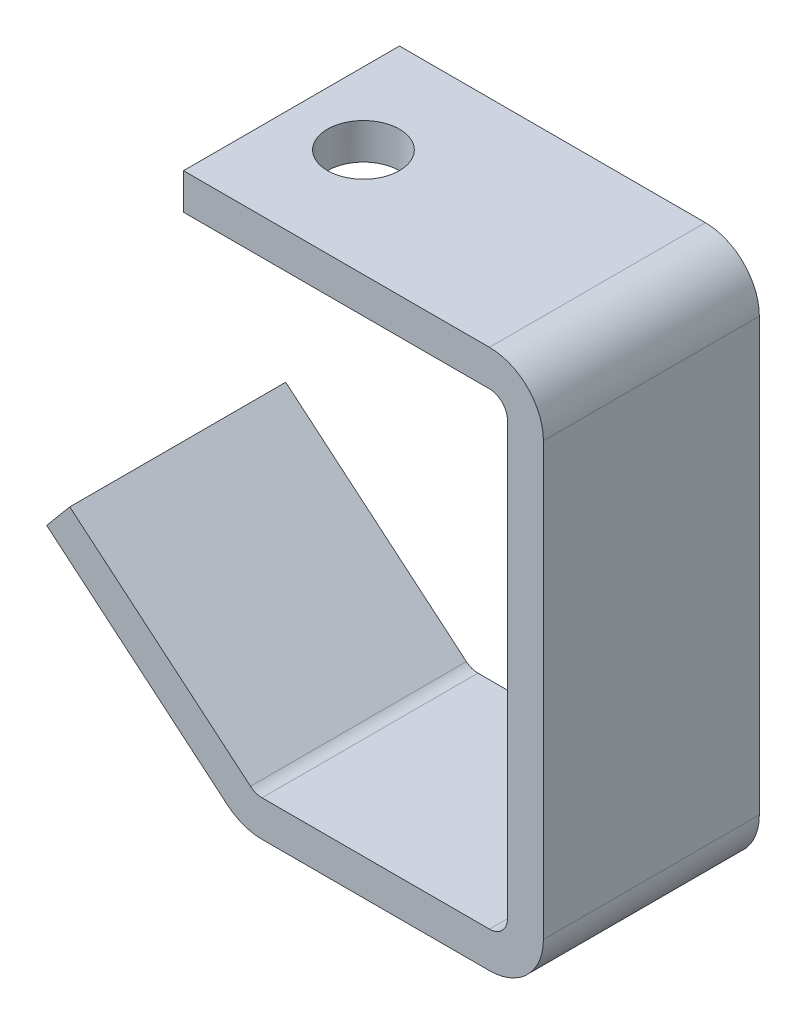
ISO-10303-21;
HEADER;
FILE_DESCRIPTION(('STEP AP214'),'2;1');
FILE_NAME('part.step','',(''),(''),'','','');
FILE_SCHEMA(('AUTOMOTIVE_DESIGN { 1 0 10303 214 1 1 1 1 }'));
ENDSEC;
DATA;
#1=APPLICATION_CONTEXT('core data for automotive mechanical design processes');
#2=APPLICATION_PROTOCOL_DEFINITION('international standard','automotive_design',2000,#1);
#3=PRODUCT_CONTEXT('',#1,'mechanical');
#4=PRODUCT('Part','Part','',(#3));
#5=PRODUCT_RELATED_PRODUCT_CATEGORY('part','',(#4));
#6=PRODUCT_DEFINITION_FORMATION('','',#4);
#7=PRODUCT_DEFINITION_CONTEXT('part definition',#1,'design');
#8=PRODUCT_DEFINITION('design','',#6,#7);
#9=PRODUCT_DEFINITION_SHAPE('','',#8);
#10=(LENGTH_UNIT() NAMED_UNIT(*) SI_UNIT(.MILLI.,.METRE.));
#11=(NAMED_UNIT(*) PLANE_ANGLE_UNIT() SI_UNIT($,.RADIAN.));
#12=(NAMED_UNIT(*) SI_UNIT($,.STERADIAN.) SOLID_ANGLE_UNIT());
#13=UNCERTAINTY_MEASURE_WITH_UNIT(LENGTH_MEASURE(1.E-05),#10,'distance_accuracy_value','');
#14=(GEOMETRIC_REPRESENTATION_CONTEXT(3) GLOBAL_UNCERTAINTY_ASSIGNED_CONTEXT((#13)) GLOBAL_UNIT_ASSIGNED_CONTEXT((#10,
#11,#12)) REPRESENTATION_CONTEXT('',''));
#15=CARTESIAN_POINT('',(0.,0.,0.));
#16=DIRECTION('',(0.,0.,1.));
#17=DIRECTION('',(1.,0.,0.));
#18=AXIS2_PLACEMENT_3D('',#15,#16,#17);
#19=CARTESIAN_POINT('',(-3.175,88.9,19.05));
#20=DIRECTION('',(0.,-1.,0.));
#21=DIRECTION('',(0.,0.,-1.));
#22=AXIS2_PLACEMENT_3D('',#19,#20,#21);
#23=PLANE('',#22);
#24=CARTESIAN_POINT('',(-44.45,88.9,0.));
#25=DIRECTION('',(0.,1.,0.));
#26=DIRECTION('',(0.,0.,1.));
#27=AXIS2_PLACEMENT_3D('',#24,#25,#26);
#28=CIRCLE('',#27,6.35);
#29=CARTESIAN_POINT('',(-44.45,88.9,6.35));
#30=VERTEX_POINT('',#29);
#31=EDGE_CURVE('E327',#30,#30,#28,.T.);
#32=ORIENTED_EDGE('',*,*,#31,.F.);
#33=EDGE_LOOP('',(#32));
#34=FACE_BOUND('',#33,.T.);
#35=DIRECTION('',(1.,0.,0.));
#36=VECTOR('',#35,1.);
#37=CARTESIAN_POINT('',(-3.175,88.9,-19.05));
#38=LINE('',#37,#36);
#39=CARTESIAN_POINT('',(-3.175,88.9,-19.05));
#40=VERTEX_POINT('',#39);
#41=CARTESIAN_POINT('',(-57.15,88.9,-19.05));
#42=VERTEX_POINT('',#41);
#43=EDGE_CURVE('E183',#40,#42,#38,.F.);
#44=ORIENTED_EDGE('',*,*,#43,.T.);
#45=DIRECTION('',(0.,0.,-1.));
#46=VECTOR('',#45,1.);
#47=CARTESIAN_POINT('',(-57.15,88.9,19.05));
#48=LINE('',#47,#46);
#49=CARTESIAN_POINT('',(-57.15,88.9,19.05));
#50=VERTEX_POINT('',#49);
#51=EDGE_CURVE('E11',#50,#42,#48,.T.);
#52=ORIENTED_EDGE('',*,*,#51,.F.);
#53=DIRECTION('',(1.,0.,0.));
#54=VECTOR('',#53,1.);
#55=CARTESIAN_POINT('',(-3.175,88.9,19.05));
#56=LINE('',#55,#54);
#57=CARTESIAN_POINT('',(-3.175,88.9,19.05));
#58=VERTEX_POINT('',#57);
#59=EDGE_CURVE('E119',#58,#50,#56,.F.);
#60=ORIENTED_EDGE('',*,*,#59,.F.);
#61=DIRECTION('',(0.,0.,-1.));
#62=VECTOR('',#61,1.);
#63=CARTESIAN_POINT('',(-3.175,88.9,19.05));
#64=LINE('',#63,#62);
#65=EDGE_CURVE('E177',#58,#40,#64,.T.);
#66=ORIENTED_EDGE('',*,*,#65,.T.);
#67=EDGE_LOOP('',(#44,#52,#60,#66));
#68=FACE_BOUND('',#67,.T.);
#69=ADVANCED_FACE('F39',(#34,#68),#23,.F.);
#70=CARTESIAN_POINT('',(-57.15,82.55,19.05));
#71=DIRECTION('',(-1.,0.,0.));
#72=DIRECTION('',(0.,0.,1.));
#73=AXIS2_PLACEMENT_3D('',#70,#71,#72);
#74=PLANE('',#73);
#75=DIRECTION('',(0.,1.,0.));
#76=VECTOR('',#75,1.);
#77=CARTESIAN_POINT('',(-57.15,82.55,-19.05));
#78=LINE('',#77,#76);
#79=CARTESIAN_POINT('',(-57.15,82.55,-19.05));
#80=VERTEX_POINT('',#79);
#81=EDGE_CURVE('E186',#80,#42,#78,.T.);
#82=ORIENTED_EDGE('',*,*,#81,.F.);
#83=DIRECTION('',(0.,0.,-1.));
#84=VECTOR('',#83,1.);
#85=CARTESIAN_POINT('',(-57.15,82.55,19.05));
#86=LINE('',#85,#84);
#87=CARTESIAN_POINT('',(-57.15,82.55,19.05));
#88=VERTEX_POINT('',#87);
#89=EDGE_CURVE('E48',#88,#80,#86,.T.);
#90=ORIENTED_EDGE('',*,*,#89,.F.);
#91=DIRECTION('',(0.,1.,0.));
#92=VECTOR('',#91,1.);
#93=CARTESIAN_POINT('',(-57.15,82.55,19.05));
#94=LINE('',#93,#92);
#95=EDGE_CURVE('E267',#88,#50,#94,.T.);
#96=ORIENTED_EDGE('',*,*,#95,.T.);
#97=ORIENTED_EDGE('',*,*,#51,.T.);
#98=EDGE_LOOP('',(#82,#90,#96,#97));
#99=FACE_BOUND('',#98,.T.);
#100=ADVANCED_FACE('F258',(#99),#74,.T.);
#101=CARTESIAN_POINT('',(-3.175,82.55,19.05));
#102=DIRECTION('',(0.,-1.,0.));
#103=DIRECTION('',(0.,0.,-1.));
#104=AXIS2_PLACEMENT_3D('',#101,#102,#103);
#105=PLANE('',#104);
#106=CARTESIAN_POINT('',(-44.45,82.55,0.));
#107=DIRECTION('',(0.,-1.,0.));
#108=DIRECTION('',(0.,0.,-1.));
#109=AXIS2_PLACEMENT_3D('',#106,#107,#108);
#110=CIRCLE('',#109,6.35);
#111=CARTESIAN_POINT('',(-44.45,82.55,-6.35));
#112=VERTEX_POINT('',#111);
#113=EDGE_CURVE('E45',#112,#112,#110,.T.);
#114=ORIENTED_EDGE('',*,*,#113,.F.);
#115=EDGE_LOOP('',(#114));
#116=FACE_BOUND('',#115,.T.);
#117=DIRECTION('',(-1.,0.,0.));
#118=VECTOR('',#117,1.);
#119=CARTESIAN_POINT('',(-3.175,82.55,-19.05));
#120=LINE('',#119,#118);
#121=CARTESIAN_POINT('',(-3.175,82.55,-19.05));
#122=VERTEX_POINT('',#121);
#123=EDGE_CURVE('E188',#122,#80,#120,.T.);
#124=ORIENTED_EDGE('',*,*,#123,.F.);
#125=DIRECTION('',(0.,0.,-1.));
#126=VECTOR('',#125,1.);
#127=CARTESIAN_POINT('',(-3.175,82.55,19.05));
#128=LINE('',#127,#126);
#129=CARTESIAN_POINT('',(-3.175,82.55,19.05));
#130=VERTEX_POINT('',#129);
#131=EDGE_CURVE('E244',#130,#122,#128,.T.);
#132=ORIENTED_EDGE('',*,*,#131,.F.);
#133=DIRECTION('',(-1.,0.,0.));
#134=VECTOR('',#133,1.);
#135=CARTESIAN_POINT('',(-3.175,82.55,19.05));
#136=LINE('',#135,#134);
#137=EDGE_CURVE('E251',#130,#88,#136,.T.);
#138=ORIENTED_EDGE('',*,*,#137,.T.);
#139=ORIENTED_EDGE('',*,*,#89,.T.);
#140=EDGE_LOOP('',(#124,#132,#138,#139));
#141=FACE_BOUND('',#140,.T.);
#142=ADVANCED_FACE('F253',(#116,#141),#105,.T.);
#143=CARTESIAN_POINT('',(-3.175,79.375,19.05));
#144=DIRECTION('',(0.,0.,-1.));
#145=DIRECTION('',(-1.,0.,0.));
#146=AXIS2_PLACEMENT_3D('',#143,#144,#145);
#147=CYLINDRICAL_SURFACE('',#146,3.175);
#148=CARTESIAN_POINT('',(-3.175,79.375,-19.05));
#149=DIRECTION('',(0.,0.,1.));
#150=DIRECTION('',(1.,0.,0.));
#151=AXIS2_PLACEMENT_3D('',#148,#149,#150);
#152=CIRCLE('',#151,3.175);
#153=CARTESIAN_POINT('',(0.,79.375,-19.05));
#154=VERTEX_POINT('',#153);
#155=EDGE_CURVE('E195',#154,#122,#152,.T.);
#156=ORIENTED_EDGE('',*,*,#155,.F.);
#157=DIRECTION('',(0.,0.,-1.));
#158=VECTOR('',#157,1.);
#159=CARTESIAN_POINT('',(0.,79.375,19.05));
#160=LINE('',#159,#158);
#161=CARTESIAN_POINT('',(0.,79.375,19.05));
#162=VERTEX_POINT('',#161);
#163=EDGE_CURVE('E241',#162,#154,#160,.T.);
#164=ORIENTED_EDGE('',*,*,#163,.F.);
#165=CARTESIAN_POINT('',(-3.175,79.375,19.05));
#166=DIRECTION('',(0.,0.,1.));
#167=DIRECTION('',(1.,0.,0.));
#168=AXIS2_PLACEMENT_3D('',#165,#166,#167);
#169=CIRCLE('',#168,3.175);
#170=EDGE_CURVE('E266',#162,#130,#169,.T.);
#171=ORIENTED_EDGE('',*,*,#170,.T.);
#172=ORIENTED_EDGE('',*,*,#131,.T.);
#173=EDGE_LOOP('',(#156,#164,#171,#172));
#174=FACE_BOUND('',#173,.T.);
#175=ADVANCED_FACE('F261',(#174),#147,.F.);
#176=CARTESIAN_POINT('',(0.,3.175,19.05));
#177=DIRECTION('',(-1.,0.,0.));
#178=DIRECTION('',(0.,0.,1.));
#179=AXIS2_PLACEMENT_3D('',#176,#177,#178);
#180=PLANE('',#179);
#181=DIRECTION('',(0.,1.,0.));
#182=VECTOR('',#181,1.);
#183=CARTESIAN_POINT('',(0.,3.175,-19.05));
#184=LINE('',#183,#182);
#185=CARTESIAN_POINT('',(0.,3.175,-19.05));
#186=VERTEX_POINT('',#185);
#187=EDGE_CURVE('E193',#186,#154,#184,.T.);
#188=ORIENTED_EDGE('',*,*,#187,.F.);
#189=DIRECTION('',(0.,0.,-1.));
#190=VECTOR('',#189,1.);
#191=CARTESIAN_POINT('',(0.,3.175,19.05));
#192=LINE('',#191,#190);
#193=CARTESIAN_POINT('',(0.,3.175,19.05));
#194=VERTEX_POINT('',#193);
#195=EDGE_CURVE('E243',#194,#186,#192,.T.);
#196=ORIENTED_EDGE('',*,*,#195,.F.);
#197=DIRECTION('',(0.,1.,0.));
#198=VECTOR('',#197,1.);
#199=CARTESIAN_POINT('',(0.,3.175,19.05));
#200=LINE('',#199,#198);
#201=EDGE_CURVE('E271',#194,#162,#200,.T.);
#202=ORIENTED_EDGE('',*,*,#201,.T.);
#203=ORIENTED_EDGE('',*,*,#163,.T.);
#204=EDGE_LOOP('',(#188,#196,#202,#203));
#205=FACE_BOUND('',#204,.T.);
#206=ADVANCED_FACE('F339',(#205),#180,.T.);
#207=CARTESIAN_POINT('',(-3.175,3.175,19.05));
#208=DIRECTION('',(0.,0.,-1.));
#209=DIRECTION('',(-1.,0.,0.));
#210=AXIS2_PLACEMENT_3D('',#207,#208,#209);
#211=CYLINDRICAL_SURFACE('',#210,3.175);
#212=CARTESIAN_POINT('',(-3.175,3.175,-19.05));
#213=DIRECTION('',(0.,0.,1.));
#214=DIRECTION('',(-1.,0.,0.));
#215=AXIS2_PLACEMENT_3D('',#212,#213,#214);
#216=CIRCLE('',#215,3.175);
#217=CARTESIAN_POINT('',(-3.175,0.,-19.05));
#218=VERTEX_POINT('',#217);
#219=EDGE_CURVE('E196',#218,#186,#216,.T.);
#220=ORIENTED_EDGE('',*,*,#219,.F.);
#221=DIRECTION('',(0.,0.,-1.));
#222=VECTOR('',#221,1.);
#223=CARTESIAN_POINT('',(-3.175,0.,19.05));
#224=LINE('',#223,#222);
#225=CARTESIAN_POINT('',(-3.175,0.,19.05));
#226=VERTEX_POINT('',#225);
#227=EDGE_CURVE('E236',#226,#218,#224,.T.);
#228=ORIENTED_EDGE('',*,*,#227,.F.);
#229=CARTESIAN_POINT('',(-3.175,3.175,19.05));
#230=DIRECTION('',(0.,0.,1.));
#231=DIRECTION('',(-1.,0.,0.));
#232=AXIS2_PLACEMENT_3D('',#229,#230,#231);
#233=CIRCLE('',#232,3.175);
#234=EDGE_CURVE('E280',#226,#194,#233,.T.);
#235=ORIENTED_EDGE('',*,*,#234,.T.);
#236=ORIENTED_EDGE('',*,*,#195,.T.);
#237=EDGE_LOOP('',(#220,#228,#235,#236));
#238=FACE_BOUND('',#237,.T.);
#239=ADVANCED_FACE('F342',(#238),#211,.F.);
#240=CARTESIAN_POINT('',(-43.2943925265276,0.,19.05));
#241=DIRECTION('',(0.,1.,0.));
#242=DIRECTION('',(0.,0.,1.));
#243=AXIS2_PLACEMENT_3D('',#240,#241,#242);
#244=PLANE('',#243);
#245=DIRECTION('',(1.,0.,0.));
#246=VECTOR('',#245,1.);
#247=CARTESIAN_POINT('',(-43.2943925265276,0.,-19.05));
#248=LINE('',#247,#246);
#249=CARTESIAN_POINT('',(-43.2943925265276,0.,-19.05));
#250=VERTEX_POINT('',#249);
#251=EDGE_CURVE('E202',#250,#218,#248,.T.);
#252=ORIENTED_EDGE('',*,*,#251,.F.);
#253=DIRECTION('',(0.,0.,-1.));
#254=VECTOR('',#253,1.);
#255=CARTESIAN_POINT('',(-43.2943925265276,0.,19.05));
#256=LINE('',#255,#254);
#257=CARTESIAN_POINT('',(-43.2943925265276,0.,19.05));
#258=VERTEX_POINT('',#257);
#259=EDGE_CURVE('E240',#258,#250,#256,.T.);
#260=ORIENTED_EDGE('',*,*,#259,.F.);
#261=DIRECTION('',(1.,0.,0.));
#262=VECTOR('',#261,1.);
#263=CARTESIAN_POINT('',(-43.2943925265276,0.,19.05));
#264=LINE('',#263,#262);
#265=EDGE_CURVE('E279',#258,#226,#264,.T.);
#266=ORIENTED_EDGE('',*,*,#265,.T.);
#267=ORIENTED_EDGE('',*,*,#227,.T.);
#268=EDGE_LOOP('',(#252,#260,#266,#267));
#269=FACE_BOUND('',#268,.T.);
#270=ADVANCED_FACE('F346',(#269),#244,.T.);
#271=CARTESIAN_POINT('',(-43.2943925265276,3.175,19.05));
#272=DIRECTION('',(0.,0.,-1.));
#273=DIRECTION('',(-1.,0.,0.));
#274=AXIS2_PLACEMENT_3D('',#271,#272,#273);
#275=CYLINDRICAL_SURFACE('',#274,3.175);
#276=CARTESIAN_POINT('',(-43.2943925265276,3.175,-19.05));
#277=DIRECTION('',(0.,0.,1.));
#278=DIRECTION('',(1.,0.,0.));
#279=AXIS2_PLACEMENT_3D('',#276,#277,#278);
#280=CIRCLE('',#279,3.175);
#281=CARTESIAN_POINT('',(-45.3352458655236,0.742811140410952,-19.05));
#282=VERTEX_POINT('',#281);
#283=EDGE_CURVE('E204',#282,#250,#280,.T.);
#284=ORIENTED_EDGE('',*,*,#283,.F.);
#285=DIRECTION('',(0.,0.,-1.));
#286=VECTOR('',#285,1.);
#287=CARTESIAN_POINT('',(-45.3352458655236,0.742811140410952,19.05));
#288=LINE('',#287,#286);
#289=CARTESIAN_POINT('',(-45.3352458655236,0.742811140410952,19.05));
#290=VERTEX_POINT('',#289);
#291=EDGE_CURVE('E234',#290,#282,#288,.T.);
#292=ORIENTED_EDGE('',*,*,#291,.F.);
#293=CARTESIAN_POINT('',(-43.2943925265276,3.175,19.05));
#294=DIRECTION('',(0.,0.,1.));
#295=DIRECTION('',(1.,0.,0.));
#296=AXIS2_PLACEMENT_3D('',#293,#294,#295);
#297=CIRCLE('',#296,3.175);
#298=EDGE_CURVE('E284',#290,#258,#297,.T.);
#299=ORIENTED_EDGE('',*,*,#298,.T.);
#300=ORIENTED_EDGE('',*,*,#259,.T.);
#301=EDGE_LOOP('',(#284,#292,#299,#300));
#302=FACE_BOUND('',#301,.T.);
#303=ADVANCED_FACE('F355',(#302),#275,.F.);
#304=CARTESIAN_POINT('',(-77.216,27.494,19.05));
#305=DIRECTION('',(0.642788453227071,0.766043735303637,0.));
#306=DIRECTION('',(-0.766043735303637,0.642788453227071,0.));
#307=AXIS2_PLACEMENT_3D('',#304,#305,#306);
#308=PLANE('',#307);
#309=DIRECTION('',(0.766043735303637,-0.642788453227071,0.));
#310=VECTOR('',#309,1.);
#311=CARTESIAN_POINT('',(-77.216,27.494,-19.05));
#312=LINE('',#311,#310);
#313=CARTESIAN_POINT('',(-77.216,27.494,-19.05));
#314=VERTEX_POINT('',#313);
#315=EDGE_CURVE('E210',#314,#282,#312,.T.);
#316=ORIENTED_EDGE('',*,*,#315,.F.);
#317=DIRECTION('',(0.,0.,-1.));
#318=VECTOR('',#317,1.);
#319=CARTESIAN_POINT('',(-77.216,27.494,19.05));
#320=LINE('',#319,#318);
#321=CARTESIAN_POINT('',(-77.216,27.494,19.05));
#322=VERTEX_POINT('',#321);
#323=EDGE_CURVE('E232',#322,#314,#320,.T.);
#324=ORIENTED_EDGE('',*,*,#323,.F.);
#325=DIRECTION('',(0.766043735303637,-0.642788453227071,0.));
#326=VECTOR('',#325,1.);
#327=CARTESIAN_POINT('',(-77.216,27.494,19.05));
#328=LINE('',#327,#326);
#329=EDGE_CURVE('E288',#322,#290,#328,.T.);
#330=ORIENTED_EDGE('',*,*,#329,.T.);
#331=ORIENTED_EDGE('',*,*,#291,.T.);
#332=EDGE_LOOP('',(#316,#324,#330,#331));
#333=FACE_BOUND('',#332,.T.);
#334=ADVANCED_FACE('F356',(#333),#308,.T.);
#335=CARTESIAN_POINT('',(-81.2977066779919,22.6296222808219,19.05));
#336=DIRECTION('',(-0.766043735303637,0.642788453227071,0.));
#337=DIRECTION('',(-0.642788453227071,-0.766043735303637,0.));
#338=AXIS2_PLACEMENT_3D('',#335,#336,#337);
#339=PLANE('',#338);
#340=DIRECTION('',(0.642788453227071,0.766043735303637,0.));
#341=VECTOR('',#340,1.);
#342=CARTESIAN_POINT('',(-81.2977066779919,22.6296222808219,-19.05));
#343=LINE('',#342,#341);
#344=CARTESIAN_POINT('',(-81.2977066779919,22.6296222808219,-19.05));
#345=VERTEX_POINT('',#344);
#346=EDGE_CURVE('E209',#345,#314,#343,.T.);
#347=ORIENTED_EDGE('',*,*,#346,.F.);
#348=DIRECTION('',(0.,0.,-1.));
#349=VECTOR('',#348,1.);
#350=CARTESIAN_POINT('',(-81.2977066779919,22.6296222808219,19.05));
#351=LINE('',#350,#349);
#352=CARTESIAN_POINT('',(-81.2977066779919,22.6296222808219,19.05));
#353=VERTEX_POINT('',#352);
#354=EDGE_CURVE('E231',#353,#345,#351,.T.);
#355=ORIENTED_EDGE('',*,*,#354,.F.);
#356=DIRECTION('',(0.642788453227071,0.766043735303637,0.));
#357=VECTOR('',#356,1.);
#358=CARTESIAN_POINT('',(-81.2977066779919,22.6296222808219,19.05));
#359=LINE('',#358,#357);
#360=EDGE_CURVE('E287',#353,#322,#359,.T.);
#361=ORIENTED_EDGE('',*,*,#360,.T.);
#362=ORIENTED_EDGE('',*,*,#323,.T.);
#363=EDGE_LOOP('',(#347,#355,#361,#362));
#364=FACE_BOUND('',#363,.T.);
#365=ADVANCED_FACE('F359',(#364),#339,.T.);
#366=CARTESIAN_POINT('',(-81.2977066779919,22.6296222808219,19.05));
#367=DIRECTION('',(0.642788453227071,0.766043735303637,0.));
#368=DIRECTION('',(-0.766043735303637,0.642788453227071,0.));
#369=AXIS2_PLACEMENT_3D('',#366,#367,#368);
#370=PLANE('',#369);
#371=DIRECTION('',(0.766043735303637,-0.642788453227071,0.));
#372=VECTOR('',#371,1.);
#373=CARTESIAN_POINT('',(-81.2977066779919,22.6296222808219,-19.05));
#374=LINE('',#373,#372);
#375=CARTESIAN_POINT('',(-49.4169525435155,-4.12156657876714,-19.05));
#376=VERTEX_POINT('',#375);
#377=EDGE_CURVE('E211',#345,#376,#374,.T.);
#378=ORIENTED_EDGE('',*,*,#377,.T.);
#379=DIRECTION('',(0.,0.,-1.));
#380=VECTOR('',#379,1.);
#381=CARTESIAN_POINT('',(-49.4169525435155,-4.12156657876714,19.05));
#382=LINE('',#381,#380);
#383=CARTESIAN_POINT('',(-49.4169525435155,-4.12156657876714,19.05));
#384=VERTEX_POINT('',#383);
#385=EDGE_CURVE('E228',#384,#376,#382,.T.);
#386=ORIENTED_EDGE('',*,*,#385,.F.);
#387=DIRECTION('',(0.766043735303637,-0.642788453227071,0.));
#388=VECTOR('',#387,1.);
#389=CARTESIAN_POINT('',(-81.2977066779919,22.6296222808219,19.05));
#390=LINE('',#389,#388);
#391=EDGE_CURVE('E295',#353,#384,#390,.T.);
#392=ORIENTED_EDGE('',*,*,#391,.F.);
#393=ORIENTED_EDGE('',*,*,#354,.T.);
#394=EDGE_LOOP('',(#378,#386,#392,#393));
#395=FACE_BOUND('',#394,.T.);
#396=ADVANCED_FACE('F362',(#395),#370,.F.);
#397=CARTESIAN_POINT('',(-43.2943925265276,3.175,19.05));
#398=DIRECTION('',(0.,0.,-1.));
#399=DIRECTION('',(-1.,0.,0.));
#400=AXIS2_PLACEMENT_3D('',#397,#398,#399);
#401=CYLINDRICAL_SURFACE('',#400,9.525);
#402=CARTESIAN_POINT('',(-43.2943925265276,3.175,-19.05));
#403=DIRECTION('',(0.,0.,1.));
#404=DIRECTION('',(1.,0.,0.));
#405=AXIS2_PLACEMENT_3D('',#402,#403,#404);
#406=CIRCLE('',#405,9.525);
#407=CARTESIAN_POINT('',(-43.2943925265276,-6.35,-19.05));
#408=VERTEX_POINT('',#407);
#409=EDGE_CURVE('E214',#376,#408,#406,.T.);
#410=ORIENTED_EDGE('',*,*,#409,.T.);
#411=DIRECTION('',(0.,0.,-1.));
#412=VECTOR('',#411,1.);
#413=CARTESIAN_POINT('',(-43.2943925265276,-6.35,19.05));
#414=LINE('',#413,#412);
#415=CARTESIAN_POINT('',(-43.2943925265276,-6.35,19.05));
#416=VERTEX_POINT('',#415);
#417=EDGE_CURVE('E224',#416,#408,#414,.T.);
#418=ORIENTED_EDGE('',*,*,#417,.F.);
#419=CARTESIAN_POINT('',(-43.2943925265276,3.175,19.05));
#420=DIRECTION('',(0.,0.,1.));
#421=DIRECTION('',(1.,0.,0.));
#422=AXIS2_PLACEMENT_3D('',#419,#420,#421);
#423=CIRCLE('',#422,9.525);
#424=EDGE_CURVE('E294',#384,#416,#423,.T.);
#425=ORIENTED_EDGE('',*,*,#424,.F.);
#426=ORIENTED_EDGE('',*,*,#385,.T.);
#427=EDGE_LOOP('',(#410,#418,#425,#426));
#428=FACE_BOUND('',#427,.T.);
#429=ADVANCED_FACE('F303',(#428),#401,.T.);
#430=CARTESIAN_POINT('',(-43.2943925265276,-6.35,19.05));
#431=DIRECTION('',(0.,1.,0.));
#432=DIRECTION('',(0.,0.,1.));
#433=AXIS2_PLACEMENT_3D('',#430,#431,#432);
#434=PLANE('',#433);
#435=DIRECTION('',(1.,0.,0.));
#436=VECTOR('',#435,1.);
#437=CARTESIAN_POINT('',(-43.2943925265276,-6.35,-19.05));
#438=LINE('',#437,#436);
#439=CARTESIAN_POINT('',(-3.17499999999999,-6.35,-19.05));
#440=VERTEX_POINT('',#439);
#441=EDGE_CURVE('E220',#408,#440,#438,.T.);
#442=ORIENTED_EDGE('',*,*,#441,.T.);
#443=DIRECTION('',(0.,0.,-1.));
#444=VECTOR('',#443,1.);
#445=CARTESIAN_POINT('',(-3.17499999999999,-6.35,19.05));
#446=LINE('',#445,#444);
#447=CARTESIAN_POINT('',(-3.17499999999999,-6.35,19.05));
#448=VERTEX_POINT('',#447);
#449=EDGE_CURVE('E174',#448,#440,#446,.T.);
#450=ORIENTED_EDGE('',*,*,#449,.F.);
#451=DIRECTION('',(1.,0.,0.));
#452=VECTOR('',#451,1.);
#453=CARTESIAN_POINT('',(-43.2943925265276,-6.35,19.05));
#454=LINE('',#453,#452);
#455=EDGE_CURVE('E164',#416,#448,#454,.T.);
#456=ORIENTED_EDGE('',*,*,#455,.F.);
#457=ORIENTED_EDGE('',*,*,#417,.T.);
#458=EDGE_LOOP('',(#442,#450,#456,#457));
#459=FACE_BOUND('',#458,.T.);
#460=ADVANCED_FACE('F304',(#459),#434,.F.);
#461=CARTESIAN_POINT('',(-3.175,3.175,19.05));
#462=DIRECTION('',(0.,0.,-1.));
#463=DIRECTION('',(-1.,0.,0.));
#464=AXIS2_PLACEMENT_3D('',#461,#462,#463);
#465=CYLINDRICAL_SURFACE('',#464,9.525);
#466=CARTESIAN_POINT('',(-3.175,3.175,-19.05));
#467=DIRECTION('',(0.,0.,1.));
#468=DIRECTION('',(1.,0.,0.));
#469=AXIS2_PLACEMENT_3D('',#466,#467,#468);
#470=CIRCLE('',#469,9.525);
#471=CARTESIAN_POINT('',(6.35,3.175,-19.05));
#472=VERTEX_POINT('',#471);
#473=EDGE_CURVE('E171',#440,#472,#470,.T.);
#474=ORIENTED_EDGE('',*,*,#473,.T.);
#475=DIRECTION('',(0.,0.,-1.));
#476=VECTOR('',#475,1.);
#477=CARTESIAN_POINT('',(6.35,3.175,19.05));
#478=LINE('',#477,#476);
#479=CARTESIAN_POINT('',(6.35,3.175,19.05));
#480=VERTEX_POINT('',#479);
#481=EDGE_CURVE('E169',#480,#472,#478,.T.);
#482=ORIENTED_EDGE('',*,*,#481,.F.);
#483=CARTESIAN_POINT('',(-3.175,3.175,19.05));
#484=DIRECTION('',(0.,0.,1.));
#485=DIRECTION('',(1.,0.,0.));
#486=AXIS2_PLACEMENT_3D('',#483,#484,#485);
#487=CIRCLE('',#486,9.525);
#488=EDGE_CURVE('E159',#448,#480,#487,.T.);
#489=ORIENTED_EDGE('',*,*,#488,.F.);
#490=ORIENTED_EDGE('',*,*,#449,.T.);
#491=EDGE_LOOP('',(#474,#482,#489,#490));
#492=FACE_BOUND('',#491,.T.);
#493=ADVANCED_FACE('F173',(#492),#465,.T.);
#494=CARTESIAN_POINT('',(6.35,3.175,19.05));
#495=DIRECTION('',(-1.,0.,0.));
#496=DIRECTION('',(0.,0.,1.));
#497=AXIS2_PLACEMENT_3D('',#494,#495,#496);
#498=PLANE('',#497);
#499=DIRECTION('',(0.,1.,0.));
#500=VECTOR('',#499,1.);
#501=CARTESIAN_POINT('',(6.35,3.175,-19.05));
#502=LINE('',#501,#500);
#503=CARTESIAN_POINT('',(6.35,79.375,-19.05));
#504=VERTEX_POINT('',#503);
#505=EDGE_CURVE('E106',#472,#504,#502,.T.);
#506=ORIENTED_EDGE('',*,*,#505,.T.);
#507=DIRECTION('',(0.,0.,-1.));
#508=VECTOR('',#507,1.);
#509=CARTESIAN_POINT('',(6.35,79.375,19.05));
#510=LINE('',#509,#508);
#511=CARTESIAN_POINT('',(6.35,79.375,19.05));
#512=VERTEX_POINT('',#511);
#513=EDGE_CURVE('E172',#512,#504,#510,.T.);
#514=ORIENTED_EDGE('',*,*,#513,.F.);
#515=DIRECTION('',(0.,1.,0.));
#516=VECTOR('',#515,1.);
#517=CARTESIAN_POINT('',(6.35,3.175,19.05));
#518=LINE('',#517,#516);
#519=EDGE_CURVE('E161',#480,#512,#518,.T.);
#520=ORIENTED_EDGE('',*,*,#519,.F.);
#521=ORIENTED_EDGE('',*,*,#481,.T.);
#522=EDGE_LOOP('',(#506,#514,#520,#521));
#523=FACE_BOUND('',#522,.T.);
#524=ADVANCED_FACE('F180',(#523),#498,.F.);
#525=CARTESIAN_POINT('',(-3.175,79.375,19.05));
#526=DIRECTION('',(0.,0.,-1.));
#527=DIRECTION('',(-1.,0.,0.));
#528=AXIS2_PLACEMENT_3D('',#525,#526,#527);
#529=CYLINDRICAL_SURFACE('',#528,9.525);
#530=CARTESIAN_POINT('',(-3.175,79.375,-19.05));
#531=DIRECTION('',(0.,0.,1.));
#532=DIRECTION('',(1.,0.,0.));
#533=AXIS2_PLACEMENT_3D('',#530,#531,#532);
#534=CIRCLE('',#533,9.525);
#535=EDGE_CURVE('E114',#504,#40,#534,.T.);
#536=ORIENTED_EDGE('',*,*,#535,.T.);
#537=ORIENTED_EDGE('',*,*,#65,.F.);
#538=CARTESIAN_POINT('',(-3.175,79.375,19.05));
#539=DIRECTION('',(0.,0.,1.));
#540=DIRECTION('',(1.,0.,0.));
#541=AXIS2_PLACEMENT_3D('',#538,#539,#540);
#542=CIRCLE('',#541,9.525);
#543=EDGE_CURVE('E57',#512,#58,#542,.T.);
#544=ORIENTED_EDGE('',*,*,#543,.F.);
#545=ORIENTED_EDGE('',*,*,#513,.T.);
#546=EDGE_LOOP('',(#536,#537,#544,#545));
#547=FACE_BOUND('',#546,.T.);
#548=ADVANCED_FACE('F310',(#547),#529,.T.);
#549=CARTESIAN_POINT('',(-3.175,79.375,19.05));
#550=DIRECTION('',(0.,0.,1.));
#551=DIRECTION('',(1.,0.,0.));
#552=AXIS2_PLACEMENT_3D('',#549,#550,#551);
#553=PLANE('',#552);
#554=ORIENTED_EDGE('',*,*,#59,.T.);
#555=ORIENTED_EDGE('',*,*,#95,.F.);
#556=ORIENTED_EDGE('',*,*,#137,.F.);
#557=ORIENTED_EDGE('',*,*,#170,.F.);
#558=ORIENTED_EDGE('',*,*,#201,.F.);
#559=ORIENTED_EDGE('',*,*,#234,.F.);
#560=ORIENTED_EDGE('',*,*,#265,.F.);
#561=ORIENTED_EDGE('',*,*,#298,.F.);
#562=ORIENTED_EDGE('',*,*,#329,.F.);
#563=ORIENTED_EDGE('',*,*,#360,.F.);
#564=ORIENTED_EDGE('',*,*,#391,.T.);
#565=ORIENTED_EDGE('',*,*,#424,.T.);
#566=ORIENTED_EDGE('',*,*,#455,.T.);
#567=ORIENTED_EDGE('',*,*,#488,.T.);
#568=ORIENTED_EDGE('',*,*,#519,.T.);
#569=ORIENTED_EDGE('',*,*,#543,.T.);
#570=EDGE_LOOP('',(#554,#555,#556,#557,#558,#559,#560,#561,#562,#563,#564,#565,#566,#567,#568,#569));
#571=FACE_BOUND('',#570,.T.);
#572=ADVANCED_FACE('F163',(#571),#553,.T.);
#573=CARTESIAN_POINT('',(-3.175,79.375,-19.05));
#574=DIRECTION('',(0.,0.,1.));
#575=DIRECTION('',(1.,0.,0.));
#576=AXIS2_PLACEMENT_3D('',#573,#574,#575);
#577=PLANE('',#576);
#578=ORIENTED_EDGE('',*,*,#43,.F.);
#579=ORIENTED_EDGE('',*,*,#535,.F.);
#580=ORIENTED_EDGE('',*,*,#505,.F.);
#581=ORIENTED_EDGE('',*,*,#473,.F.);
#582=ORIENTED_EDGE('',*,*,#441,.F.);
#583=ORIENTED_EDGE('',*,*,#409,.F.);
#584=ORIENTED_EDGE('',*,*,#377,.F.);
#585=ORIENTED_EDGE('',*,*,#346,.T.);
#586=ORIENTED_EDGE('',*,*,#315,.T.);
#587=ORIENTED_EDGE('',*,*,#283,.T.);
#588=ORIENTED_EDGE('',*,*,#251,.T.);
#589=ORIENTED_EDGE('',*,*,#219,.T.);
#590=ORIENTED_EDGE('',*,*,#187,.T.);
#591=ORIENTED_EDGE('',*,*,#155,.T.);
#592=ORIENTED_EDGE('',*,*,#123,.T.);
#593=ORIENTED_EDGE('',*,*,#81,.T.);
#594=EDGE_LOOP('',(#578,#579,#580,#581,#582,#583,#584,#585,#586,#587,#588,#589,#590,#591,#592,#593));
#595=FACE_BOUND('',#594,.T.);
#596=ADVANCED_FACE('F260',(#595),#577,.F.);
#597=CARTESIAN_POINT('',(-44.45,78.9,0.));
#598=DIRECTION('',(0.,1.,0.));
#599=DIRECTION('',(0.,0.,1.));
#600=AXIS2_PLACEMENT_3D('',#597,#598,#599);
#601=CYLINDRICAL_SURFACE('',#600,6.35);
#602=ORIENTED_EDGE('',*,*,#113,.T.);
#603=EDGE_LOOP('',(#602));
#604=FACE_BOUND('',#603,.T.);
#605=ORIENTED_EDGE('',*,*,#31,.T.);
#606=EDGE_LOOP('',(#605));
#607=FACE_BOUND('',#606,.T.);
#608=ADVANCED_FACE('F335',(#604,#607),#601,.F.);
#609=CLOSED_SHELL('',(#69,#100,#142,#175,#206,#239,#270,#303,#334,#365,#396,#429,#460,#493,#524,
#548,#572,#596,#608));
#610=MANIFOLD_SOLID_BREP('B2',#609);
#611=ADVANCED_BREP_SHAPE_REPRESENTATION('',(#18,#610),#14);
#612=SHAPE_DEFINITION_REPRESENTATION(#9,#611);
ENDSEC;
END-ISO-10303-21;
